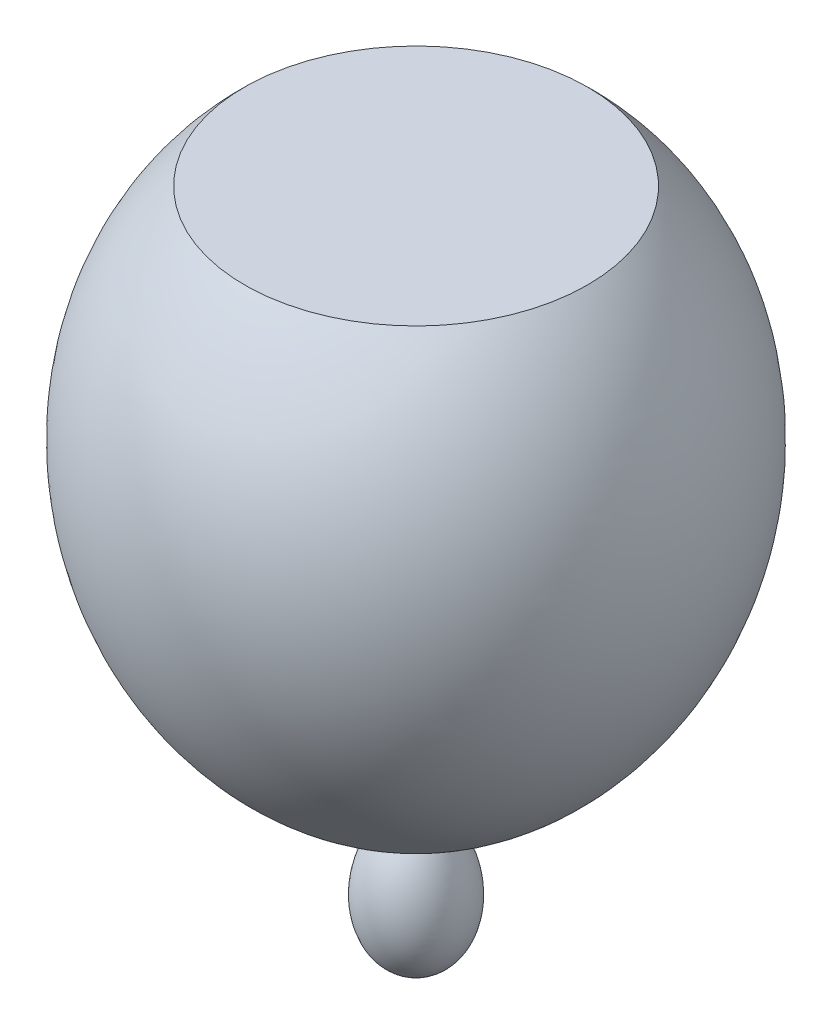
ISO-10303-21;
HEADER;
FILE_DESCRIPTION(('STEP AP214'),'2;1');
FILE_NAME('part.step','',(''),(''),'','','');
FILE_SCHEMA(('AUTOMOTIVE_DESIGN { 1 0 10303 214 1 1 1 1 }'));
ENDSEC;
DATA;
#1=APPLICATION_CONTEXT('core data for automotive mechanical design processes');
#2=APPLICATION_PROTOCOL_DEFINITION('international standard','automotive_design',2000,#1);
#3=PRODUCT_CONTEXT('',#1,'mechanical');
#4=PRODUCT('Part','Part','',(#3));
#5=PRODUCT_RELATED_PRODUCT_CATEGORY('part','',(#4));
#6=PRODUCT_DEFINITION_FORMATION('','',#4);
#7=PRODUCT_DEFINITION_CONTEXT('part definition',#1,'design');
#8=PRODUCT_DEFINITION('design','',#6,#7);
#9=PRODUCT_DEFINITION_SHAPE('','',#8);
#10=(LENGTH_UNIT() NAMED_UNIT(*) SI_UNIT(.MILLI.,.METRE.));
#11=(NAMED_UNIT(*) PLANE_ANGLE_UNIT() SI_UNIT($,.RADIAN.));
#12=(NAMED_UNIT(*) SI_UNIT($,.STERADIAN.) SOLID_ANGLE_UNIT());
#13=UNCERTAINTY_MEASURE_WITH_UNIT(LENGTH_MEASURE(1.E-05),#10,'distance_accuracy_value','');
#14=(GEOMETRIC_REPRESENTATION_CONTEXT(3) GLOBAL_UNCERTAINTY_ASSIGNED_CONTEXT((#13)) GLOBAL_UNIT_ASSIGNED_CONTEXT((#10,
#11,#12)) REPRESENTATION_CONTEXT('',''));
#15=CARTESIAN_POINT('',(0.,0.,0.));
#16=DIRECTION('',(0.,0.,1.));
#17=DIRECTION('',(1.,0.,0.));
#18=AXIS2_PLACEMENT_3D('',#15,#16,#17);
#19=CARTESIAN_POINT('',(-1.0398853970985E-11,-79.5774715459477,0.));
#20=CARTESIAN_POINT('',(0.0876805923341404,-79.5774715459478,0.));
#21=CARTESIAN_POINT('',(0.263797972575064,-79.5762299115467,0.));
#22=CARTESIAN_POINT('',(0.598650590856886,-79.5706425508887,0.));
#23=CARTESIAN_POINT('',(0.950876652571486,-79.5557486563722,0.));
#24=CARTESIAN_POINT('',(1.35262547212403,-79.5334221241474,0.));
#25=CARTESIAN_POINT('',(1.72703176838669,-79.5036800391544,0.));
#26=CARTESIAN_POINT('',(2.11530944355549,-79.4665451551406,0.));
#27=CARTESIAN_POINT('',(2.49518978074726,-79.4220456154996,0.));
#28=CARTESIAN_POINT('',(2.97332683239408,-79.357257557479,0.));
#29=CARTESIAN_POINT('',(3.54269888813024,-79.264927606383,0.));
#30=CARTESIAN_POINT('',(4.20460476573237,-79.1361341339061,0.));
#31=CARTESIAN_POINT('',(4.95420601058507,-78.9604694530783,0.));
#32=CARTESIAN_POINT('',(5.88274142070473,-78.7059305412052,0.));
#33=CARTESIAN_POINT('',(6.98062102196149,-78.3456897199416,0.));
#34=CARTESIAN_POINT('',(8.05511024966161,-77.9193233853256,0.));
#35=CARTESIAN_POINT('',(9.10205208383472,-77.4304669791197,0.));
#36=CARTESIAN_POINT('',(9.95460225664503,-76.9834055975815,0.));
#37=CARTESIAN_POINT('',(10.6240501917869,-76.6027582295668,0.));
#38=CARTESIAN_POINT('',(11.4444934505436,-76.0992379641618,0.));
#39=CARTESIAN_POINT('',(12.4018408014167,-75.4523461029347,0.));
#40=CARTESIAN_POINT('',(13.477279244194,-74.6390919759678,0.));
#41=CARTESIAN_POINT('',(14.6469295160346,-73.6360306984476,0.));
#42=CARTESIAN_POINT('',(16.0324846638131,-72.2982632564667,0.));
#43=CARTESIAN_POINT('',(17.5703966008741,-70.5710496856625,0.));
#44=CARTESIAN_POINT('',(19.0328275386001,-68.6021378476665,0.));
#45=CARTESIAN_POINT('',(20.3892255649037,-66.3962176969675,0.));
#46=CARTESIAN_POINT('',(21.5824370302139,-64.0991845678398,0.));
#47=CARTESIAN_POINT('',(22.4618657728492,-62.078453783561,0.));
#48=CARTESIAN_POINT('',(23.1713994969415,-60.1395719774442,0.));
#49=CARTESIAN_POINT('',(24.0780617054906,-57.195387525395,0.));
#50=CARTESIAN_POINT('',(24.931218987006,-53.4348933087704,0.));
#51=CARTESIAN_POINT('',(25.5220972050229,-48.4503546408996,0.));
#52=CARTESIAN_POINT('',(25.4671494748604,-42.275747962825,0.));
#53=CARTESIAN_POINT('',(24.6891735038918,-36.1519800546308,0.));
#54=CARTESIAN_POINT('',(23.237769759558,-30.1532766900786,0.));
#55=CARTESIAN_POINT('',(21.1535663445063,-24.3446370051788,0.));
#56=CARTESIAN_POINT('',(18.468657066632,-18.7882038275258,0.));
#57=CARTESIAN_POINT('',(15.2067873874591,-13.5488188649898,0.));
#58=CARTESIAN_POINT('',(11.8635522330858,-9.31351533749863,0.));
#59=CARTESIAN_POINT('',(8.65194495273465,-5.99775760871078,0.));
#60=CARTESIAN_POINT('',(6.02821040277064,-3.74744605475118,0.));
#61=CARTESIAN_POINT('',(4.18687293272993,-2.36896894898637,0.));
#62=CARTESIAN_POINT('',(2.79098993640259,-1.4557689738408,0.));
#63=CARTESIAN_POINT('',(1.89911185390225,-0.927774967500933,0.));
#64=CARTESIAN_POINT('',(1.20891495810726,-0.555188094697185,0.));
#65=CARTESIAN_POINT('',(0.792765610770951,-0.345754338027514,0.));
#66=CARTESIAN_POINT('',(0.430888145668768,-0.176914065924159,0.));
#67=CARTESIAN_POINT('',(0.186212553313267,-0.0719592793469132,0.));
#68=CARTESIAN_POINT('',(0.0623290833588892,-0.023341488057453,0.));
#69=CARTESIAN_POINT('',(-6.9406626701159E-12,0.,0.));
#70=B_SPLINE_CURVE_WITH_KNOTS('',4,(#19,#20,#21,#22,#23,#24,#25,#26,#27,#28,#29,#30,#31,#32,#33,
#34,#35,#36,#37,#38,#39,#40,#41,#42,#43,#44,#45,#46,#47,#48,#49,#50,#51,#52,#53,#54,#55,#56,#57,
#58,#59,#60,#61,#62,#63,#64,#65,#66,#67,#68,#69),.UNSPECIFIED.,.F.,.F.,(5,1,1,1,1,1,1,1,1,1,1,1,
1,1,1,1,1,1,1,1,1,1,1,1,1,1,1,1,1,1,1,1,1,1,1,1,1,1,1,1,1,1,1,1,1,1,1,5),(0.0889842727979694,
0.0924312928800519,0.0958783129621343,0.0993253330442168,0.102772353126299,0.106219373208382,
0.109666393290464,0.113113413372547,0.116560433454629,0.123454483320074,0.130348533185519,
0.137242583050964,0.144136632916409,0.157924696562186,0.171712760207964,0.178606822642936,
0.185500885077909,0.192394947512881,0.199289009947854,0.213077084610209,0.226865159272564,
0.240653288577068,0.254441417881571,0.282017661504337,0.309593764096882,0.32834201604834,
0.347090267999798,0.374666472698493,0.388454575047841,0.402242677397188,0.457395073933465,
0.512547464731353,0.567699899774951,0.622852335697732,0.678004748424371,0.733157135249234,
0.788309674961777,0.84346197685155,0.898614443046644,0.925986448179912,0.953358453313181,
0.967146068268635,0.980933683224089,0.985700262418067,0.990466841612045,0.995233420806022,
0.997616710403011,1.),.UNSPECIFIED.);
#71=CARTESIAN_POINT('',(-6.9309172405346E-12,-79.5774715459477,0.));
#72=DIRECTION('',(0.,-1.,0.));
#73=AXIS1_PLACEMENT('',#71,#72);
#74=SURFACE_OF_REVOLUTION('',#70,#73);
#75=CARTESIAN_POINT('',(-6.9309172405346E-12,0.,0.));
#76=VERTEX_POINT('',#75);
#77=VERTEX_LOOP('',#76);
#78=FACE_BOUND('',#77,.T.);
#79=CARTESIAN_POINT('',(-6.9309172405346E-12,-79.5774715459477,0.));
#80=VERTEX_POINT('',#79);
#81=VERTEX_LOOP('',#80);
#82=FACE_BOUND('',#81,.T.);
#83=ADVANCED_FACE('P0_F15',(#78,#82),#74,.F.);
#84=CLOSED_SHELL('',(#83));
#85=MANIFOLD_SOLID_BREP('P0_B1',#84);
#86=CARTESIAN_POINT('',(-9.02064160134579E-09,3.1816759286215E-09,0.));
#87=CARTESIAN_POINT('',(0.0919895729443937,-0.0302149336545484,0.));
#88=CARTESIAN_POINT('',(0.276985160327375,-0.0872521054657558,0.));
#89=CARTESIAN_POINT('',(0.651025601425253,-0.187798966696515,0.));
#90=CARTESIAN_POINT('',(1.12269819844917,-0.296732641462193,0.));
#91=CARTESIAN_POINT('',(1.78687975458292,-0.431368155203873,0.));
#92=CARTESIAN_POINT('',(2.74162501986766,-0.592094226334403,0.));
#93=CARTESIAN_POINT('',(3.89368650964849,-0.743441748074737,0.));
#94=CARTESIAN_POINT('',(5.3828970604025,-0.878736697370538,0.));
#95=CARTESIAN_POINT('',(7.0157139190803,-0.964240306474483,0.));
#96=CARTESIAN_POINT('',(8.69341162135753,-0.993855838084443,0.));
#97=CARTESIAN_POINT('',(10.4140724243929,-0.969044452293767,0.));
#98=CARTESIAN_POINT('',(12.940843471997,-0.858456297153208,0.));
#99=CARTESIAN_POINT('',(16.2666344528607,-0.565795725635427,0.));
#100=CARTESIAN_POINT('',(20.4501342043987,0.0295210109739374,0.));
#101=CARTESIAN_POINT('',(25.4572202949051,1.05707472621122,0.));
#102=CARTESIAN_POINT('',(30.473634045075,2.38234925124876,0.));
#103=CARTESIAN_POINT('',(35.4876157904692,3.9907421203627,0.));
#104=CARTESIAN_POINT('',(40.4176259866832,5.8396870632358,0.));
#105=CARTESIAN_POINT('',(45.2583222034429,7.91073025472049,0.));
#106=CARTESIAN_POINT('',(51.9288529799939,11.1111375340293,0.));
#107=CARTESIAN_POINT('',(61.8351189688833,16.6607159377781,0.));
#108=CARTESIAN_POINT('',(74.4218570595126,25.4106417702472,0.));
#109=CARTESIAN_POINT('',(88.8023728553696,38.2750700488586,0.));
#110=CARTESIAN_POINT('',(102.610809616223,54.2394111948669,0.));
#111=CARTESIAN_POINT('',(114.380492331146,71.7558431189886,0.));
#112=CARTESIAN_POINT('',(124.012069939433,90.5304655968965,0.));
#113=CARTESIAN_POINT('',(130.488447554441,107.819733575913,0.));
#114=CARTESIAN_POINT('',(134.592531575903,123.088241118437,0.));
#115=CARTESIAN_POINT('',(137.023436310791,136.027627029394,0.));
#116=CARTESIAN_POINT('',(138.365467235831,146.474444178929,0.));
#117=CARTESIAN_POINT('',(139.096219756259,156.98182399063,0.));
#118=CARTESIAN_POINT('',(139.207889834686,167.514102999382,0.));
#119=CARTESIAN_POINT('',(138.693565855039,178.034552359664,0.));
#120=CARTESIAN_POINT('',(137.547432357181,188.505187397892,0.));
#121=CARTESIAN_POINT('',(135.764966432317,198.88664432866,0.));
#122=CARTESIAN_POINT('',(133.343198251097,209.13805259877,0.));
#123=CARTESIAN_POINT('',(130.280993262746,219.216953733366,0.));
#124=CARTESIAN_POINT('',(126.579382252238,229.079252776955,0.));
#125=CARTESIAN_POINT('',(122.784110510932,237.479223571644,0.));
#126=CARTESIAN_POINT('',(119.441545144121,243.90181003839,0.));
#127=CARTESIAN_POINT('',(116.829197832421,248.471805700559,0.));
#128=CARTESIAN_POINT('',(115.132149087322,251.290070823472,0.));
#129=CARTESIAN_POINT('',(113.736126906298,253.521102102436,0.));
#130=CARTESIAN_POINT('',(112.301898628909,255.727808502877,0.));
#131=CARTESIAN_POINT('',(110.829765162762,257.909339257172,0.));
#132=CARTESIAN_POINT('',(109.319853588063,260.065021840011,0.));
#133=CARTESIAN_POINT('',(107.772630662674,262.193872296983,0.));
#134=CARTESIAN_POINT('',(106.188040412183,264.295420015974,0.));
#135=CARTESIAN_POINT('',(104.566957609198,266.368319848878,0.));
#136=CARTESIAN_POINT('',(103.115952966282,268.157206700425,0.));
#137=CARTESIAN_POINT('',(101.850548571772,269.670954859716,0.));
#138=CARTESIAN_POINT('',(100.779582664981,270.921128035513,0.));
#139=CARTESIAN_POINT('',(99.916536979227,271.910996123083,0.));
#140=CARTESIAN_POINT('',(99.0392085271871,272.898191983706,0.));
#141=CARTESIAN_POINT('',(98.1626101786328,273.868316913903,0.));
#142=CARTESIAN_POINT('',(97.2610438180522,274.845872730424,0.));
#143=CARTESIAN_POINT('',(96.3774564647715,275.789772177133,0.));
#144=CARTESIAN_POINT('',(95.4428981626205,276.765771151537,0.));
#145=CARTESIAN_POINT('',(94.5661599967783,277.669921291071,0.));
#146=CARTESIAN_POINT('',(93.5839515648378,278.658249353166,0.));
#147=CARTESIAN_POINT('',(92.7477431021319,279.49048058174,0.));
#148=CARTESIAN_POINT('',(91.9235309096582,280.290495928694,0.));
#149=CARTESIAN_POINT('',(91.4897850564285,280.707715471515,0.));
#150=CARTESIAN_POINT('',(91.2743497558321,280.913563574228,0.));
#151=B_SPLINE_CURVE_WITH_KNOTS('',4,(#86,#87,#88,#89,#90,#91,#92,#93,#94,#95,#96,#97,#98,#99,
#100,#101,#102,#103,#104,#105,#106,#107,#108,#109,#110,#111,#112,#113,#114,#115,#116,#117,#118,
#119,#120,#121,#122,#123,#124,#125,#126,#127,#128,#129,#130,#131,#132,#133,#134,#135,#136,#137,
#138,#139,#140,#141,#142,#143,#144,#145,#146,#147,#148,#149,#150),.UNSPECIFIED.,.F.,.F.,(5,1,1,
1,1,1,1,1,1,1,1,1,1,1,1,1,1,1,1,1,1,1,1,1,1,1,1,1,1,1,1,1,1,1,1,1,1,1,1,1,1,1,1,1,1,1,1,1,1,1,1,
1,1,1,1,1,1,1,1,1,1,5),(0.,0.000955617203619004,0.00191123440723801,0.00382246881447601,
0.00477808601809502,0.00764493762895203,0.011467406443428,0.0152898752579041,0.0195362686625174,
0.0237826620671308,0.0280290554717442,0.0322754488763576,0.0445010014893165,0.0567265541022754,
0.0697167832980973,0.0827070124939191,0.0956970841725638,0.108687155851209,0.121677227709757,
0.134667299568306,0.168714412930418,0.22067448184913,0.272634490893054,0.324594549483768,
0.376554581413197,0.428514577807029,0.480474525779837,0.506454548806797,0.532434571833758,
0.558414577262192,0.584394582690625,0.610374588662463,0.6363545946343,0.662334599369199,
0.688314604104098,0.714294610413489,0.740274616722881,0.766254617566215,0.79223461840955,
0.805224617532564,0.811719617094071,0.818214616655578,0.824709616217085,0.831204615778593,
0.8376996153401,0.844194614901607,0.850689614063246,0.857184613224885,0.863679612386524,
0.870174611548163,0.873422111128982,0.876669610709802,0.879917110290621,0.883164609871441,
0.88641210945226,0.88965960903308,0.892907108613899,0.896154608194718,0.899390298089957,
0.902625987985196,0.905861677880435,0.909097367775674),.UNSPECIFIED.);
#152=CARTESIAN_POINT('',(-9.02064534180624E-09,3.18167714397077E-09,0.));
#153=DIRECTION('',(0.,-1.,0.));
#154=AXIS1_PLACEMENT('',#152,#153);
#155=SURFACE_OF_REVOLUTION('',#151,#154);
#156=CARTESIAN_POINT('',(-9.02064534180624E-09,280.913563574418,0.));
#157=DIRECTION('',(0.,-1.,0.));
#158=DIRECTION('',(0.,0.,-1.));
#159=AXIS2_PLACEMENT_3D('',#156,#157,#158);
#160=CIRCLE('',#159,91.2743497642689);
#161=CARTESIAN_POINT('',(-9.02064534180624E-09,280.913563574418,-91.2743497642689));
#162=VERTEX_POINT('',#161);
#163=EDGE_CURVE('P1_E11',#162,#162,#160,.T.);
#164=ORIENTED_EDGE('',*,*,#163,.T.);
#165=EDGE_LOOP('',(#164));
#166=FACE_BOUND('',#165,.T.);
#167=CARTESIAN_POINT('',(-9.02064534180624E-09,3.18167714397077E-09,0.));
#168=VERTEX_POINT('',#167);
#169=VERTEX_LOOP('',#168);
#170=FACE_BOUND('',#169,.T.);
#171=ADVANCED_FACE('P1_F17',(#166,#170),#155,.F.);
#172=CARTESIAN_POINT('',(91.2743497552483,280.913563574418,0.));
#173=DIRECTION('',(0.,1.,0.));
#174=DIRECTION('',(0.,0.,1.));
#175=AXIS2_PLACEMENT_3D('',#172,#173,#174);
#176=PLANE('',#175);
#177=ORIENTED_EDGE('',*,*,#163,.F.);
#178=EDGE_LOOP('',(#177));
#179=FACE_BOUND('',#178,.T.);
#180=ADVANCED_FACE('P1_F26',(#179),#176,.T.);
#181=CLOSED_SHELL('',(#171,#180));
#182=MANIFOLD_SOLID_BREP('P1_B1',#181);
#183=ADVANCED_BREP_SHAPE_REPRESENTATION('',(#18,#85,#182),#14);
#184=SHAPE_DEFINITION_REPRESENTATION(#9,#183);
ENDSEC;
END-ISO-10303-21;
